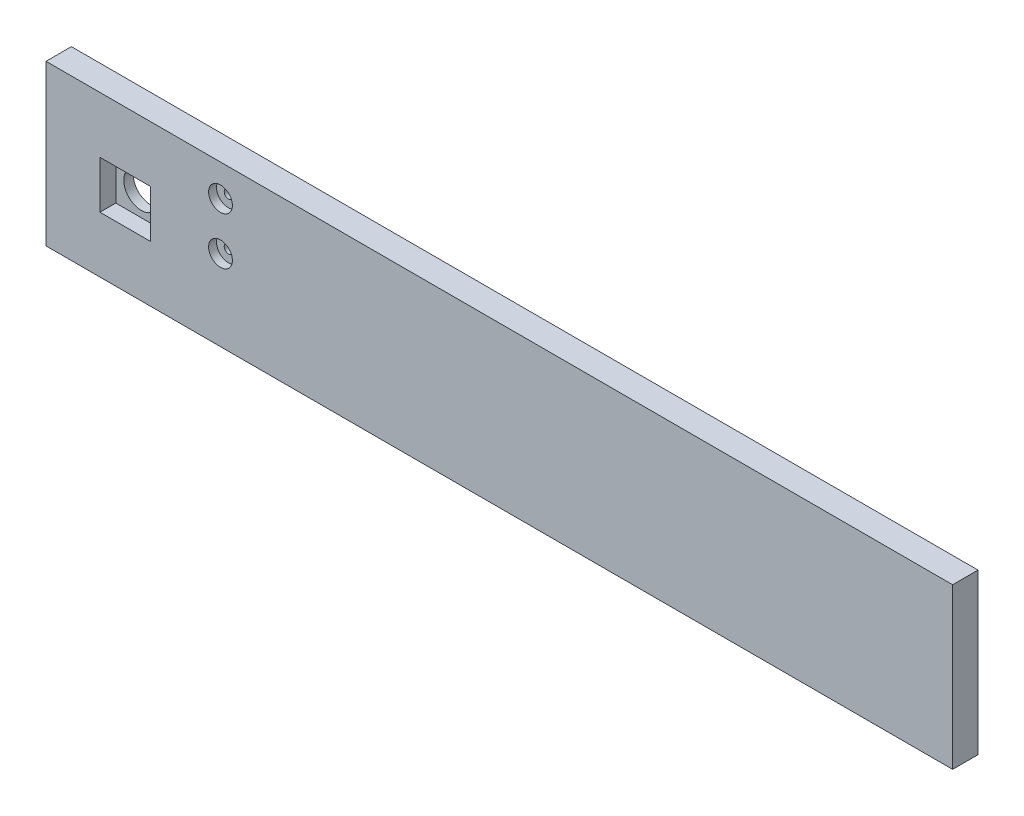
ISO-10303-21;
HEADER;
FILE_DESCRIPTION(('STEP AP214'),'2;1');
FILE_NAME('part.step','',(''),(''),'','','');
FILE_SCHEMA(('AUTOMOTIVE_DESIGN { 1 0 10303 214 1 1 1 1 }'));
ENDSEC;
DATA;
#1=APPLICATION_CONTEXT('core data for automotive mechanical design processes');
#2=APPLICATION_PROTOCOL_DEFINITION('international standard','automotive_design',2000,#1);
#3=PRODUCT_CONTEXT('',#1,'mechanical');
#4=PRODUCT('Part','Part','',(#3));
#5=PRODUCT_RELATED_PRODUCT_CATEGORY('part','',(#4));
#6=PRODUCT_DEFINITION_FORMATION('','',#4);
#7=PRODUCT_DEFINITION_CONTEXT('part definition',#1,'design');
#8=PRODUCT_DEFINITION('design','',#6,#7);
#9=PRODUCT_DEFINITION_SHAPE('','',#8);
#10=(LENGTH_UNIT() NAMED_UNIT(*) SI_UNIT(.MILLI.,.METRE.));
#11=(NAMED_UNIT(*) PLANE_ANGLE_UNIT() SI_UNIT($,.RADIAN.));
#12=(NAMED_UNIT(*) SI_UNIT($,.STERADIAN.) SOLID_ANGLE_UNIT());
#13=UNCERTAINTY_MEASURE_WITH_UNIT(LENGTH_MEASURE(1.E-05),#10,'distance_accuracy_value','');
#14=(GEOMETRIC_REPRESENTATION_CONTEXT(3) GLOBAL_UNCERTAINTY_ASSIGNED_CONTEXT((#13)) GLOBAL_UNIT_ASSIGNED_CONTEXT((#10,
#11,#12)) REPRESENTATION_CONTEXT('',''));
#15=CARTESIAN_POINT('',(0.,0.,0.));
#16=DIRECTION('',(0.,0.,1.));
#17=DIRECTION('',(1.,0.,0.));
#18=AXIS2_PLACEMENT_3D('',#15,#16,#17);
#19=CARTESIAN_POINT('',(110.,50.8,-8.));
#20=DIRECTION('',(0.,0.,1.));
#21=DIRECTION('',(1.,0.,0.));
#22=AXIS2_PLACEMENT_3D('',#19,#20,#21);
#23=CYLINDRICAL_SURFACE('',#22,2.65);
#24=CARTESIAN_POINT('',(110.,50.8,3.));
#25=DIRECTION('',(0.,0.,1.));
#26=DIRECTION('',(1.,0.,0.));
#27=AXIS2_PLACEMENT_3D('',#24,#25,#26);
#28=CIRCLE('',#27,2.65);
#29=CARTESIAN_POINT('',(112.65,50.8,3.));
#30=VERTEX_POINT('',#29);
#31=EDGE_CURVE('E152',#30,#30,#28,.F.);
#32=ORIENTED_EDGE('',*,*,#31,.F.);
#33=EDGE_LOOP('',(#32));
#34=FACE_BOUND('',#33,.T.);
#35=CARTESIAN_POINT('',(110.,50.8,-3.));
#36=DIRECTION('',(0.,0.,-1.));
#37=DIRECTION('',(-1.,0.,0.));
#38=AXIS2_PLACEMENT_3D('',#35,#36,#37);
#39=CIRCLE('',#38,2.65);
#40=CARTESIAN_POINT('',(107.35,50.8,-3.));
#41=VERTEX_POINT('',#40);
#42=EDGE_CURVE('E46',#41,#41,#39,.F.);
#43=ORIENTED_EDGE('',*,*,#42,.F.);
#44=EDGE_LOOP('',(#43));
#45=FACE_BOUND('',#44,.T.);
#46=ADVANCED_FACE('F42',(#34,#45),#23,.F.);
#47=CARTESIAN_POINT('',(110.,80.8,-8.));
#48=DIRECTION('',(0.,0.,1.));
#49=DIRECTION('',(1.,0.,0.));
#50=AXIS2_PLACEMENT_3D('',#47,#48,#49);
#51=CYLINDRICAL_SURFACE('',#50,2.65);
#52=CARTESIAN_POINT('',(110.,80.8,3.));
#53=DIRECTION('',(0.,0.,1.));
#54=DIRECTION('',(1.,0.,0.));
#55=AXIS2_PLACEMENT_3D('',#52,#53,#54);
#56=CIRCLE('',#55,2.65);
#57=CARTESIAN_POINT('',(112.65,80.8,3.));
#58=VERTEX_POINT('',#57);
#59=EDGE_CURVE('E187',#58,#58,#56,.F.);
#60=ORIENTED_EDGE('',*,*,#59,.F.);
#61=EDGE_LOOP('',(#60));
#62=FACE_BOUND('',#61,.T.);
#63=CARTESIAN_POINT('',(110.,80.8,-3.));
#64=DIRECTION('',(0.,0.,-1.));
#65=DIRECTION('',(-1.,0.,0.));
#66=AXIS2_PLACEMENT_3D('',#63,#64,#65);
#67=CIRCLE('',#66,2.65);
#68=CARTESIAN_POINT('',(107.35,80.8,-3.));
#69=VERTEX_POINT('',#68);
#70=EDGE_CURVE('E192',#69,#69,#67,.F.);
#71=ORIENTED_EDGE('',*,*,#70,.F.);
#72=EDGE_LOOP('',(#71));
#73=FACE_BOUND('',#72,.T.);
#74=ADVANCED_FACE('F241',(#62,#73),#51,.F.);
#75=CARTESIAN_POINT('',(50.,50.4,-8.));
#76=DIRECTION('',(0.,0.,1.));
#77=DIRECTION('',(1.,0.,0.));
#78=AXIS2_PLACEMENT_3D('',#75,#76,#77);
#79=CYLINDRICAL_SURFACE('',#78,11.);
#80=CARTESIAN_POINT('',(50.,50.4,-8.));
#81=DIRECTION('',(0.,0.,1.));
#82=DIRECTION('',(1.,0.,0.));
#83=AXIS2_PLACEMENT_3D('',#80,#81,#82);
#84=CIRCLE('',#83,11.);
#85=CARTESIAN_POINT('',(61.,50.4,-8.));
#86=VERTEX_POINT('',#85);
#87=EDGE_CURVE('E162',#86,#86,#84,.T.);
#88=ORIENTED_EDGE('',*,*,#87,.F.);
#89=EDGE_LOOP('',(#88));
#90=FACE_BOUND('',#89,.T.);
#91=CARTESIAN_POINT('',(50.,50.4,-2.));
#92=DIRECTION('',(0.,0.,1.));
#93=DIRECTION('',(1.,0.,0.));
#94=AXIS2_PLACEMENT_3D('',#91,#92,#93);
#95=CIRCLE('',#94,11.);
#96=CARTESIAN_POINT('',(61.,50.4,-2.));
#97=VERTEX_POINT('',#96);
#98=EDGE_CURVE('E158',#97,#97,#95,.F.);
#99=ORIENTED_EDGE('',*,*,#98,.F.);
#100=EDGE_LOOP('',(#99));
#101=FACE_BOUND('',#100,.T.);
#102=ADVANCED_FACE('F247',(#90,#101),#79,.F.);
#103=CARTESIAN_POINT('',(0.,0.,8.));
#104=DIRECTION('',(1.,0.,0.));
#105=DIRECTION('',(0.,0.,-1.));
#106=AXIS2_PLACEMENT_3D('',#103,#104,#105);
#107=PLANE('',#106);
#108=DIRECTION('',(0.,-1.,0.));
#109=VECTOR('',#108,1.);
#110=CARTESIAN_POINT('',(0.,0.,-8.));
#111=LINE('',#110,#109);
#112=CARTESIAN_POINT('',(0.,100.8,-8.));
#113=VERTEX_POINT('',#112);
#114=CARTESIAN_POINT('',(0.,0.,-8.));
#115=VERTEX_POINT('',#114);
#116=EDGE_CURVE('E165',#113,#115,#111,.T.);
#117=ORIENTED_EDGE('',*,*,#116,.T.);
#118=DIRECTION('',(0.,0.,-1.));
#119=VECTOR('',#118,1.);
#120=CARTESIAN_POINT('',(0.,0.,8.));
#121=LINE('',#120,#119);
#122=CARTESIAN_POINT('',(0.,0.,8.));
#123=VERTEX_POINT('',#122);
#124=EDGE_CURVE('E11',#123,#115,#121,.T.);
#125=ORIENTED_EDGE('',*,*,#124,.F.);
#126=DIRECTION('',(0.,-1.,0.));
#127=VECTOR('',#126,1.);
#128=CARTESIAN_POINT('',(0.,0.,8.));
#129=LINE('',#128,#127);
#130=CARTESIAN_POINT('',(0.,100.8,8.));
#131=VERTEX_POINT('',#130);
#132=EDGE_CURVE('E166',#131,#123,#129,.T.);
#133=ORIENTED_EDGE('',*,*,#132,.F.);
#134=DIRECTION('',(0.,0.,-1.));
#135=VECTOR('',#134,1.);
#136=CARTESIAN_POINT('',(0.,100.8,8.));
#137=LINE('',#136,#135);
#138=EDGE_CURVE('E172',#131,#113,#137,.T.);
#139=ORIENTED_EDGE('',*,*,#138,.T.);
#140=EDGE_LOOP('',(#117,#125,#133,#139));
#141=FACE_BOUND('',#140,.T.);
#142=ADVANCED_FACE('F44',(#141),#107,.F.);
#143=CARTESIAN_POINT('',(0.,0.,8.));
#144=DIRECTION('',(0.,1.,0.));
#145=DIRECTION('',(0.,0.,1.));
#146=AXIS2_PLACEMENT_3D('',#143,#144,#145);
#147=PLANE('',#146);
#148=DIRECTION('',(1.,0.,0.));
#149=VECTOR('',#148,1.);
#150=CARTESIAN_POINT('',(0.,0.,-8.));
#151=LINE('',#150,#149);
#152=CARTESIAN_POINT('',(571.5,0.,-8.));
#153=VERTEX_POINT('',#152);
#154=EDGE_CURVE('E175',#115,#153,#151,.T.);
#155=ORIENTED_EDGE('',*,*,#154,.T.);
#156=DIRECTION('',(0.,0.,-1.));
#157=VECTOR('',#156,1.);
#158=CARTESIAN_POINT('',(571.5,0.,8.));
#159=LINE('',#158,#157);
#160=CARTESIAN_POINT('',(571.5,0.,8.));
#161=VERTEX_POINT('',#160);
#162=EDGE_CURVE('E51',#161,#153,#159,.T.);
#163=ORIENTED_EDGE('',*,*,#162,.F.);
#164=DIRECTION('',(1.,0.,0.));
#165=VECTOR('',#164,1.);
#166=CARTESIAN_POINT('',(0.,0.,8.));
#167=LINE('',#166,#165);
#168=EDGE_CURVE('E96',#123,#161,#167,.T.);
#169=ORIENTED_EDGE('',*,*,#168,.F.);
#170=ORIENTED_EDGE('',*,*,#124,.T.);
#171=EDGE_LOOP('',(#155,#163,#169,#170));
#172=FACE_BOUND('',#171,.T.);
#173=ADVANCED_FACE('F267',(#172),#147,.F.);
#174=CARTESIAN_POINT('',(571.5,0.,8.));
#175=DIRECTION('',(-1.,0.,0.));
#176=DIRECTION('',(0.,0.,1.));
#177=AXIS2_PLACEMENT_3D('',#174,#175,#176);
#178=PLANE('',#177);
#179=DIRECTION('',(0.,1.,0.));
#180=VECTOR('',#179,1.);
#181=CARTESIAN_POINT('',(571.5,0.,-8.));
#182=LINE('',#181,#180);
#183=CARTESIAN_POINT('',(571.5,100.8,-8.));
#184=VERTEX_POINT('',#183);
#185=EDGE_CURVE('E177',#153,#184,#182,.T.);
#186=ORIENTED_EDGE('',*,*,#185,.T.);
#187=DIRECTION('',(0.,0.,-1.));
#188=VECTOR('',#187,1.);
#189=CARTESIAN_POINT('',(571.5,100.8,8.));
#190=LINE('',#189,#188);
#191=CARTESIAN_POINT('',(571.5,100.8,8.));
#192=VERTEX_POINT('',#191);
#193=EDGE_CURVE('E181',#192,#184,#190,.T.);
#194=ORIENTED_EDGE('',*,*,#193,.F.);
#195=DIRECTION('',(0.,1.,0.));
#196=VECTOR('',#195,1.);
#197=CARTESIAN_POINT('',(571.5,0.,8.));
#198=LINE('',#197,#196);
#199=EDGE_CURVE('E169',#161,#192,#198,.T.);
#200=ORIENTED_EDGE('',*,*,#199,.F.);
#201=ORIENTED_EDGE('',*,*,#162,.T.);
#202=EDGE_LOOP('',(#186,#194,#200,#201));
#203=FACE_BOUND('',#202,.T.);
#204=ADVANCED_FACE('F265',(#203),#178,.F.);
#205=CARTESIAN_POINT('',(0.,100.8,8.));
#206=DIRECTION('',(0.,-1.,0.));
#207=DIRECTION('',(0.,0.,-1.));
#208=AXIS2_PLACEMENT_3D('',#205,#206,#207);
#209=PLANE('',#208);
#210=DIRECTION('',(-1.,0.,0.));
#211=VECTOR('',#210,1.);
#212=CARTESIAN_POINT('',(0.,100.8,-8.));
#213=LINE('',#212,#211);
#214=EDGE_CURVE('E89',#184,#113,#213,.T.);
#215=ORIENTED_EDGE('',*,*,#214,.T.);
#216=ORIENTED_EDGE('',*,*,#138,.F.);
#217=DIRECTION('',(-1.,0.,0.));
#218=VECTOR('',#217,1.);
#219=CARTESIAN_POINT('',(0.,100.8,8.));
#220=LINE('',#219,#218);
#221=EDGE_CURVE('E68',#192,#131,#220,.T.);
#222=ORIENTED_EDGE('',*,*,#221,.F.);
#223=ORIENTED_EDGE('',*,*,#193,.T.);
#224=EDGE_LOOP('',(#215,#216,#222,#223));
#225=FACE_BOUND('',#224,.T.);
#226=ADVANCED_FACE('F258',(#225),#209,.F.);
#227=CARTESIAN_POINT('',(0.,0.,8.));
#228=DIRECTION('',(0.,0.,-1.));
#229=DIRECTION('',(-1.,0.,0.));
#230=AXIS2_PLACEMENT_3D('',#227,#228,#229);
#231=PLANE('',#230);
#232=CARTESIAN_POINT('',(110.,80.8,8.));
#233=DIRECTION('',(0.,0.,1.));
#234=DIRECTION('',(1.,0.,0.));
#235=AXIS2_PLACEMENT_3D('',#232,#233,#234);
#236=CIRCLE('',#235,7.5);
#237=CARTESIAN_POINT('',(117.5,80.8,8.));
#238=VERTEX_POINT('',#237);
#239=EDGE_CURVE('E214',#238,#238,#236,.T.);
#240=ORIENTED_EDGE('',*,*,#239,.F.);
#241=EDGE_LOOP('',(#240));
#242=FACE_BOUND('',#241,.T.);
#243=CARTESIAN_POINT('',(110.,50.8,8.));
#244=DIRECTION('',(0.,0.,1.));
#245=DIRECTION('',(1.,0.,0.));
#246=AXIS2_PLACEMENT_3D('',#243,#244,#245);
#247=CIRCLE('',#246,7.50000000000001);
#248=CARTESIAN_POINT('',(117.5,50.8,8.));
#249=VERTEX_POINT('',#248);
#250=EDGE_CURVE('E216',#249,#249,#247,.T.);
#251=ORIENTED_EDGE('',*,*,#250,.F.);
#252=EDGE_LOOP('',(#251));
#253=FACE_BOUND('',#252,.T.);
#254=DIRECTION('',(-1.,0.,0.));
#255=VECTOR('',#254,1.);
#256=CARTESIAN_POINT('',(34.,65.4,8.));
#257=LINE('',#256,#255);
#258=CARTESIAN_POINT('',(66.,65.4,8.));
#259=VERTEX_POINT('',#258);
#260=CARTESIAN_POINT('',(34.,65.4,8.));
#261=VERTEX_POINT('',#260);
#262=EDGE_CURVE('E151',#259,#261,#257,.T.);
#263=ORIENTED_EDGE('',*,*,#262,.F.);
#264=DIRECTION('',(0.,1.,0.));
#265=VECTOR('',#264,1.);
#266=CARTESIAN_POINT('',(66.,65.4,8.));
#267=LINE('',#266,#265);
#268=CARTESIAN_POINT('',(66.,35.4,8.));
#269=VERTEX_POINT('',#268);
#270=EDGE_CURVE('E59',#269,#259,#267,.T.);
#271=ORIENTED_EDGE('',*,*,#270,.F.);
#272=DIRECTION('',(1.,0.,0.));
#273=VECTOR('',#272,1.);
#274=CARTESIAN_POINT('',(34.,35.4,8.));
#275=LINE('',#274,#273);
#276=CARTESIAN_POINT('',(34.,35.4,8.));
#277=VERTEX_POINT('',#276);
#278=EDGE_CURVE('E139',#277,#269,#275,.T.);
#279=ORIENTED_EDGE('',*,*,#278,.F.);
#280=DIRECTION('',(0.,-1.,0.));
#281=VECTOR('',#280,1.);
#282=CARTESIAN_POINT('',(34.,65.4,8.));
#283=LINE('',#282,#281);
#284=EDGE_CURVE('E142',#261,#277,#283,.T.);
#285=ORIENTED_EDGE('',*,*,#284,.F.);
#286=EDGE_LOOP('',(#263,#271,#279,#285));
#287=FACE_BOUND('',#286,.T.);
#288=ORIENTED_EDGE('',*,*,#132,.T.);
#289=ORIENTED_EDGE('',*,*,#168,.T.);
#290=ORIENTED_EDGE('',*,*,#199,.T.);
#291=ORIENTED_EDGE('',*,*,#221,.T.);
#292=EDGE_LOOP('',(#288,#289,#290,#291));
#293=FACE_BOUND('',#292,.T.);
#294=ADVANCED_FACE('F254',(#242,#253,#287,#293),#231,.F.);
#295=CARTESIAN_POINT('',(0.,0.,-8.));
#296=DIRECTION('',(0.,0.,-1.));
#297=DIRECTION('',(-1.,0.,0.));
#298=AXIS2_PLACEMENT_3D('',#295,#296,#297);
#299=PLANE('',#298);
#300=CARTESIAN_POINT('',(110.,80.8,-8.));
#301=DIRECTION('',(0.,0.,-1.));
#302=DIRECTION('',(-1.,0.,0.));
#303=AXIS2_PLACEMENT_3D('',#300,#301,#302);
#304=CIRCLE('',#303,7.5);
#305=CARTESIAN_POINT('',(102.5,80.8,-8.));
#306=VERTEX_POINT('',#305);
#307=EDGE_CURVE('E199',#306,#306,#304,.T.);
#308=ORIENTED_EDGE('',*,*,#307,.F.);
#309=EDGE_LOOP('',(#308));
#310=FACE_BOUND('',#309,.T.);
#311=CARTESIAN_POINT('',(110.,50.8,-8.));
#312=DIRECTION('',(0.,0.,-1.));
#313=DIRECTION('',(-1.,0.,0.));
#314=AXIS2_PLACEMENT_3D('',#311,#312,#313);
#315=CIRCLE('',#314,7.50000000000001);
#316=CARTESIAN_POINT('',(102.5,50.8,-8.));
#317=VERTEX_POINT('',#316);
#318=EDGE_CURVE('E209',#317,#317,#315,.T.);
#319=ORIENTED_EDGE('',*,*,#318,.F.);
#320=EDGE_LOOP('',(#319));
#321=FACE_BOUND('',#320,.T.);
#322=ORIENTED_EDGE('',*,*,#87,.T.);
#323=EDGE_LOOP('',(#322));
#324=FACE_BOUND('',#323,.T.);
#325=ORIENTED_EDGE('',*,*,#116,.F.);
#326=ORIENTED_EDGE('',*,*,#214,.F.);
#327=ORIENTED_EDGE('',*,*,#185,.F.);
#328=ORIENTED_EDGE('',*,*,#154,.F.);
#329=EDGE_LOOP('',(#325,#326,#327,#328));
#330=FACE_BOUND('',#329,.T.);
#331=ADVANCED_FACE('F257',(#310,#321,#324,#330),#299,.T.);
#332=CARTESIAN_POINT('',(0.,0.,-2.));
#333=DIRECTION('',(0.,0.,1.));
#334=DIRECTION('',(1.,0.,0.));
#335=AXIS2_PLACEMENT_3D('',#332,#333,#334);
#336=PLANE('',#335);
#337=DIRECTION('',(0.,1.,0.));
#338=VECTOR('',#337,1.);
#339=CARTESIAN_POINT('',(66.,65.4,-2.));
#340=LINE('',#339,#338);
#341=CARTESIAN_POINT('',(66.,35.4,-2.));
#342=VERTEX_POINT('',#341);
#343=CARTESIAN_POINT('',(66.,65.4,-2.));
#344=VERTEX_POINT('',#343);
#345=EDGE_CURVE('E120',#342,#344,#340,.T.);
#346=ORIENTED_EDGE('',*,*,#345,.T.);
#347=DIRECTION('',(-1.,0.,0.));
#348=VECTOR('',#347,1.);
#349=CARTESIAN_POINT('',(34.,65.4,-2.));
#350=LINE('',#349,#348);
#351=CARTESIAN_POINT('',(34.,65.4,-2.));
#352=VERTEX_POINT('',#351);
#353=EDGE_CURVE('E129',#344,#352,#350,.T.);
#354=ORIENTED_EDGE('',*,*,#353,.T.);
#355=DIRECTION('',(0.,-1.,0.));
#356=VECTOR('',#355,1.);
#357=CARTESIAN_POINT('',(34.,65.4,-2.));
#358=LINE('',#357,#356);
#359=CARTESIAN_POINT('',(34.,35.4,-2.));
#360=VERTEX_POINT('',#359);
#361=EDGE_CURVE('E134',#352,#360,#358,.T.);
#362=ORIENTED_EDGE('',*,*,#361,.T.);
#363=DIRECTION('',(1.,0.,0.));
#364=VECTOR('',#363,1.);
#365=CARTESIAN_POINT('',(34.,35.4,-2.));
#366=LINE('',#365,#364);
#367=EDGE_CURVE('E126',#360,#342,#366,.T.);
#368=ORIENTED_EDGE('',*,*,#367,.T.);
#369=EDGE_LOOP('',(#346,#354,#362,#368));
#370=FACE_BOUND('',#369,.T.);
#371=ORIENTED_EDGE('',*,*,#98,.T.);
#372=EDGE_LOOP('',(#371));
#373=FACE_BOUND('',#372,.T.);
#374=ADVANCED_FACE('F136',(#370,#373),#336,.T.);
#375=CARTESIAN_POINT('',(66.,65.4,-2.));
#376=DIRECTION('',(1.,0.,0.));
#377=DIRECTION('',(0.,0.,-1.));
#378=AXIS2_PLACEMENT_3D('',#375,#376,#377);
#379=PLANE('',#378);
#380=ORIENTED_EDGE('',*,*,#270,.T.);
#381=DIRECTION('',(0.,0.,1.));
#382=VECTOR('',#381,1.);
#383=CARTESIAN_POINT('',(66.,65.4,-2.));
#384=LINE('',#383,#382);
#385=EDGE_CURVE('E116',#344,#259,#384,.T.);
#386=ORIENTED_EDGE('',*,*,#385,.F.);
#387=ORIENTED_EDGE('',*,*,#345,.F.);
#388=DIRECTION('',(0.,0.,1.));
#389=VECTOR('',#388,1.);
#390=CARTESIAN_POINT('',(66.,35.4,-2.));
#391=LINE('',#390,#389);
#392=EDGE_CURVE('E156',#342,#269,#391,.T.);
#393=ORIENTED_EDGE('',*,*,#392,.T.);
#394=EDGE_LOOP('',(#380,#386,#387,#393));
#395=FACE_BOUND('',#394,.T.);
#396=ADVANCED_FACE('F118',(#395),#379,.F.);
#397=CARTESIAN_POINT('',(34.,35.4,-2.));
#398=DIRECTION('',(0.,-1.,0.));
#399=DIRECTION('',(0.,0.,-1.));
#400=AXIS2_PLACEMENT_3D('',#397,#398,#399);
#401=PLANE('',#400);
#402=ORIENTED_EDGE('',*,*,#278,.T.);
#403=ORIENTED_EDGE('',*,*,#392,.F.);
#404=ORIENTED_EDGE('',*,*,#367,.F.);
#405=DIRECTION('',(0.,0.,1.));
#406=VECTOR('',#405,1.);
#407=CARTESIAN_POINT('',(34.,35.4,-2.));
#408=LINE('',#407,#406);
#409=EDGE_CURVE('E159',#360,#277,#408,.T.);
#410=ORIENTED_EDGE('',*,*,#409,.T.);
#411=EDGE_LOOP('',(#402,#403,#404,#410));
#412=FACE_BOUND('',#411,.T.);
#413=ADVANCED_FACE('F293',(#412),#401,.F.);
#414=CARTESIAN_POINT('',(34.,65.4,-2.));
#415=DIRECTION('',(-1.,0.,0.));
#416=DIRECTION('',(0.,-1.,0.));
#417=AXIS2_PLACEMENT_3D('',#414,#415,#416);
#418=PLANE('',#417);
#419=ORIENTED_EDGE('',*,*,#284,.T.);
#420=ORIENTED_EDGE('',*,*,#409,.F.);
#421=ORIENTED_EDGE('',*,*,#361,.F.);
#422=DIRECTION('',(0.,0.,1.));
#423=VECTOR('',#422,1.);
#424=CARTESIAN_POINT('',(34.,65.4,-2.));
#425=LINE('',#424,#423);
#426=EDGE_CURVE('E125',#352,#261,#425,.T.);
#427=ORIENTED_EDGE('',*,*,#426,.T.);
#428=EDGE_LOOP('',(#419,#420,#421,#427));
#429=FACE_BOUND('',#428,.T.);
#430=ADVANCED_FACE('F297',(#429),#418,.F.);
#431=CARTESIAN_POINT('',(34.,65.4,-2.));
#432=DIRECTION('',(0.,1.,0.));
#433=DIRECTION('',(0.,0.,1.));
#434=AXIS2_PLACEMENT_3D('',#431,#432,#433);
#435=PLANE('',#434);
#436=ORIENTED_EDGE('',*,*,#262,.T.);
#437=ORIENTED_EDGE('',*,*,#426,.F.);
#438=ORIENTED_EDGE('',*,*,#353,.F.);
#439=ORIENTED_EDGE('',*,*,#385,.T.);
#440=EDGE_LOOP('',(#436,#437,#438,#439));
#441=FACE_BOUND('',#440,.T.);
#442=ADVANCED_FACE('F130',(#441),#435,.F.);
#443=CARTESIAN_POINT('',(110.,80.8,3.));
#444=DIRECTION('',(0.,0.,1.));
#445=DIRECTION('',(1.,0.,0.));
#446=AXIS2_PLACEMENT_3D('',#443,#444,#445);
#447=PLANE('',#446);
#448=CARTESIAN_POINT('',(110.,80.8,3.));
#449=DIRECTION('',(0.,0.,1.));
#450=DIRECTION('',(1.,0.,0.));
#451=AXIS2_PLACEMENT_3D('',#448,#449,#450);
#452=CIRCLE('',#451,7.5);
#453=CARTESIAN_POINT('',(117.5,80.8,3.));
#454=VERTEX_POINT('',#453);
#455=EDGE_CURVE('E190',#454,#454,#452,.T.);
#456=ORIENTED_EDGE('',*,*,#455,.T.);
#457=EDGE_LOOP('',(#456));
#458=FACE_BOUND('',#457,.T.);
#459=ORIENTED_EDGE('',*,*,#59,.T.);
#460=EDGE_LOOP('',(#459));
#461=FACE_BOUND('',#460,.T.);
#462=ADVANCED_FACE('F296',(#458,#461),#447,.T.);
#463=CARTESIAN_POINT('',(110.,80.8,3.));
#464=DIRECTION('',(0.,0.,1.));
#465=DIRECTION('',(1.,0.,0.));
#466=AXIS2_PLACEMENT_3D('',#463,#464,#465);
#467=CYLINDRICAL_SURFACE('',#466,7.5);
#468=ORIENTED_EDGE('',*,*,#455,.F.);
#469=EDGE_LOOP('',(#468));
#470=FACE_BOUND('',#469,.T.);
#471=ORIENTED_EDGE('',*,*,#239,.T.);
#472=EDGE_LOOP('',(#471));
#473=FACE_BOUND('',#472,.T.);
#474=ADVANCED_FACE('F238',(#470,#473),#467,.F.);
#475=CARTESIAN_POINT('',(110.,50.8,3.));
#476=DIRECTION('',(0.,0.,1.));
#477=DIRECTION('',(1.,0.,0.));
#478=AXIS2_PLACEMENT_3D('',#475,#476,#477);
#479=PLANE('',#478);
#480=CARTESIAN_POINT('',(110.,50.8,3.));
#481=DIRECTION('',(0.,0.,1.));
#482=DIRECTION('',(1.,0.,0.));
#483=AXIS2_PLACEMENT_3D('',#480,#481,#482);
#484=CIRCLE('',#483,7.50000000000001);
#485=CARTESIAN_POINT('',(117.5,50.8,3.));
#486=VERTEX_POINT('',#485);
#487=EDGE_CURVE('E145',#486,#486,#484,.T.);
#488=ORIENTED_EDGE('',*,*,#487,.T.);
#489=EDGE_LOOP('',(#488));
#490=FACE_BOUND('',#489,.T.);
#491=ORIENTED_EDGE('',*,*,#31,.T.);
#492=EDGE_LOOP('',(#491));
#493=FACE_BOUND('',#492,.T.);
#494=ADVANCED_FACE('F223',(#490,#493),#479,.T.);
#495=CARTESIAN_POINT('',(110.,50.8,3.));
#496=DIRECTION('',(0.,0.,1.));
#497=DIRECTION('',(1.,0.,0.));
#498=AXIS2_PLACEMENT_3D('',#495,#496,#497);
#499=CYLINDRICAL_SURFACE('',#498,7.50000000000001);
#500=ORIENTED_EDGE('',*,*,#487,.F.);
#501=EDGE_LOOP('',(#500));
#502=FACE_BOUND('',#501,.T.);
#503=ORIENTED_EDGE('',*,*,#250,.T.);
#504=EDGE_LOOP('',(#503));
#505=FACE_BOUND('',#504,.T.);
#506=ADVANCED_FACE('F226',(#502,#505),#499,.F.);
#507=CARTESIAN_POINT('',(110.,50.8,-3.));
#508=DIRECTION('',(0.,0.,-1.));
#509=DIRECTION('',(-1.,0.,0.));
#510=AXIS2_PLACEMENT_3D('',#507,#508,#509);
#511=PLANE('',#510);
#512=CARTESIAN_POINT('',(110.,50.8,-3.));
#513=DIRECTION('',(0.,0.,-1.));
#514=DIRECTION('',(-1.,0.,0.));
#515=AXIS2_PLACEMENT_3D('',#512,#513,#514);
#516=CIRCLE('',#515,7.50000000000001);
#517=CARTESIAN_POINT('',(102.5,50.8,-3.));
#518=VERTEX_POINT('',#517);
#519=EDGE_CURVE('E204',#518,#518,#516,.T.);
#520=ORIENTED_EDGE('',*,*,#519,.T.);
#521=EDGE_LOOP('',(#520));
#522=FACE_BOUND('',#521,.T.);
#523=ORIENTED_EDGE('',*,*,#42,.T.);
#524=EDGE_LOOP('',(#523));
#525=FACE_BOUND('',#524,.T.);
#526=ADVANCED_FACE('F228',(#522,#525),#511,.T.);
#527=CARTESIAN_POINT('',(110.,50.8,-3.));
#528=DIRECTION('',(0.,0.,-1.));
#529=DIRECTION('',(-1.,0.,0.));
#530=AXIS2_PLACEMENT_3D('',#527,#528,#529);
#531=CYLINDRICAL_SURFACE('',#530,7.50000000000001);
#532=ORIENTED_EDGE('',*,*,#519,.F.);
#533=EDGE_LOOP('',(#532));
#534=FACE_BOUND('',#533,.T.);
#535=ORIENTED_EDGE('',*,*,#318,.T.);
#536=EDGE_LOOP('',(#535));
#537=FACE_BOUND('',#536,.T.);
#538=ADVANCED_FACE('F235',(#534,#537),#531,.F.);
#539=CARTESIAN_POINT('',(110.,80.8,-3.));
#540=DIRECTION('',(0.,0.,-1.));
#541=DIRECTION('',(-1.,0.,0.));
#542=AXIS2_PLACEMENT_3D('',#539,#540,#541);
#543=PLANE('',#542);
#544=CARTESIAN_POINT('',(110.,80.8,-3.));
#545=DIRECTION('',(0.,0.,-1.));
#546=DIRECTION('',(-1.,0.,0.));
#547=AXIS2_PLACEMENT_3D('',#544,#545,#546);
#548=CIRCLE('',#547,7.5);
#549=CARTESIAN_POINT('',(102.5,80.8,-3.));
#550=VERTEX_POINT('',#549);
#551=EDGE_CURVE('E194',#550,#550,#548,.T.);
#552=ORIENTED_EDGE('',*,*,#551,.T.);
#553=EDGE_LOOP('',(#552));
#554=FACE_BOUND('',#553,.T.);
#555=ORIENTED_EDGE('',*,*,#70,.T.);
#556=EDGE_LOOP('',(#555));
#557=FACE_BOUND('',#556,.T.);
#558=ADVANCED_FACE('F384',(#554,#557),#543,.T.);
#559=CARTESIAN_POINT('',(110.,80.8,-3.));
#560=DIRECTION('',(0.,0.,-1.));
#561=DIRECTION('',(-1.,0.,0.));
#562=AXIS2_PLACEMENT_3D('',#559,#560,#561);
#563=CYLINDRICAL_SURFACE('',#562,7.5);
#564=ORIENTED_EDGE('',*,*,#551,.F.);
#565=EDGE_LOOP('',(#564));
#566=FACE_BOUND('',#565,.T.);
#567=ORIENTED_EDGE('',*,*,#307,.T.);
#568=EDGE_LOOP('',(#567));
#569=FACE_BOUND('',#568,.T.);
#570=ADVANCED_FACE('F394',(#566,#569),#563,.F.);
#571=CLOSED_SHELL('',(#46,#74,#102,#142,#173,#204,#226,#294,#331,#374,#396,#413,#430,#442,#462,
#474,#494,#506,#526,#538,#558,#570));
#572=MANIFOLD_SOLID_BREP('B2',#571);
#573=ADVANCED_BREP_SHAPE_REPRESENTATION('',(#18,#572),#14);
#574=SHAPE_DEFINITION_REPRESENTATION(#9,#573);
ENDSEC;
END-ISO-10303-21;
